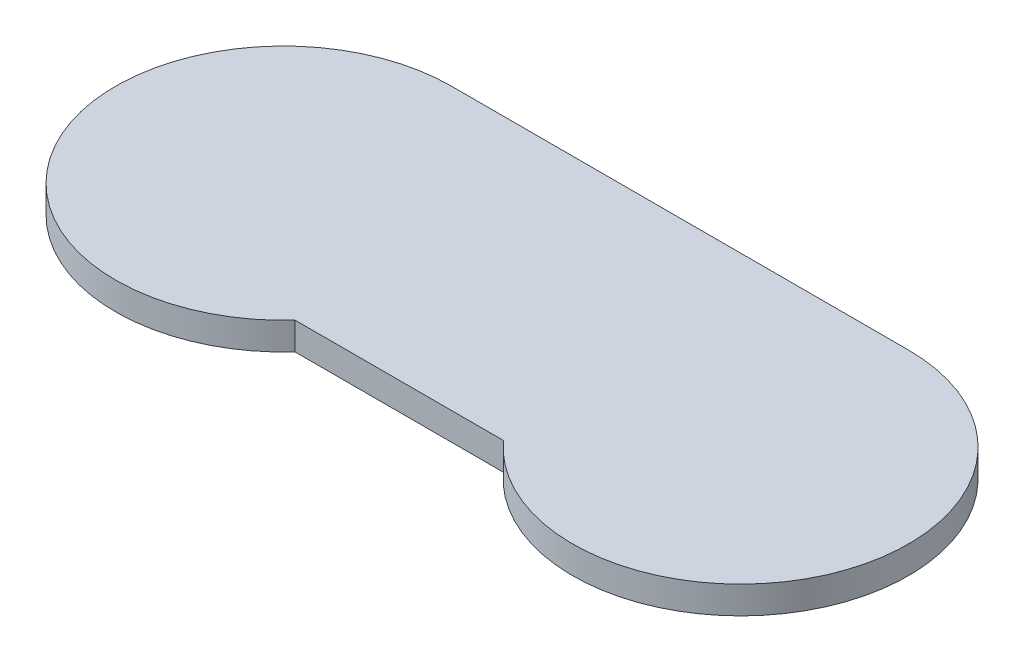
ISO-10303-21;
HEADER;
FILE_DESCRIPTION(('STEP AP214'),'2;1');
FILE_NAME('part.step','',(''),(''),'','','');
FILE_SCHEMA(('AUTOMOTIVE_DESIGN { 1 0 10303 214 1 1 1 1 }'));
ENDSEC;
DATA;
#1=APPLICATION_CONTEXT('core data for automotive mechanical design processes');
#2=APPLICATION_PROTOCOL_DEFINITION('international standard','automotive_design',2000,#1);
#3=PRODUCT_CONTEXT('',#1,'mechanical');
#4=PRODUCT('Part','Part','',(#3));
#5=PRODUCT_RELATED_PRODUCT_CATEGORY('part','',(#4));
#6=PRODUCT_DEFINITION_FORMATION('','',#4);
#7=PRODUCT_DEFINITION_CONTEXT('part definition',#1,'design');
#8=PRODUCT_DEFINITION('design','',#6,#7);
#9=PRODUCT_DEFINITION_SHAPE('','',#8);
#10=(LENGTH_UNIT() NAMED_UNIT(*) SI_UNIT(.MILLI.,.METRE.));
#11=(NAMED_UNIT(*) PLANE_ANGLE_UNIT() SI_UNIT($,.RADIAN.));
#12=(NAMED_UNIT(*) SI_UNIT($,.STERADIAN.) SOLID_ANGLE_UNIT());
#13=UNCERTAINTY_MEASURE_WITH_UNIT(LENGTH_MEASURE(1.E-05),#10,'distance_accuracy_value','');
#14=(GEOMETRIC_REPRESENTATION_CONTEXT(3) GLOBAL_UNCERTAINTY_ASSIGNED_CONTEXT((#13)) GLOBAL_UNIT_ASSIGNED_CONTEXT((#10,
#11,#12)) REPRESENTATION_CONTEXT('',''));
#15=CARTESIAN_POINT('',(0.,0.,0.));
#16=DIRECTION('',(0.,0.,1.));
#17=DIRECTION('',(1.,0.,0.));
#18=AXIS2_PLACEMENT_3D('',#15,#16,#17);
#19=CARTESIAN_POINT('',(-41.5000000000001,5.,0.));
#20=DIRECTION('',(0.,-1.,0.));
#21=DIRECTION('',(0.,0.,-1.));
#22=AXIS2_PLACEMENT_3D('',#19,#20,#21);
#23=CYLINDRICAL_SURFACE('',#22,30.5);
#24=CARTESIAN_POINT('',(-41.5000000000001,0.,0.));
#25=DIRECTION('',(0.,1.,0.));
#26=DIRECTION('',(0.,0.,1.));
#27=AXIS2_PLACEMENT_3D('',#24,#25,#26);
#28=CIRCLE('',#27,30.5);
#29=CARTESIAN_POINT('',(-41.5000000000001,0.,-30.5));
#30=VERTEX_POINT('',#29);
#31=CARTESIAN_POINT('',(-18.9168204187277,0.,20.5));
#32=VERTEX_POINT('',#31);
#33=EDGE_CURVE('E96',#30,#32,#28,.T.);
#34=ORIENTED_EDGE('',*,*,#33,.T.);
#35=DIRECTION('',(0.,-1.,0.));
#36=VECTOR('',#35,1.);
#37=CARTESIAN_POINT('',(-18.9168204187277,5.,20.5));
#38=LINE('',#37,#36);
#39=CARTESIAN_POINT('',(-18.9168204187277,5.,20.5));
#40=VERTEX_POINT('',#39);
#41=EDGE_CURVE('E11',#40,#32,#38,.T.);
#42=ORIENTED_EDGE('',*,*,#41,.F.);
#43=CARTESIAN_POINT('',(-41.5000000000001,5.,0.));
#44=DIRECTION('',(0.,1.,0.));
#45=DIRECTION('',(0.,0.,1.));
#46=AXIS2_PLACEMENT_3D('',#43,#44,#45);
#47=CIRCLE('',#46,30.5);
#48=CARTESIAN_POINT('',(-41.5000000000001,5.,-30.5));
#49=VERTEX_POINT('',#48);
#50=EDGE_CURVE('E84',#49,#40,#47,.T.);
#51=ORIENTED_EDGE('',*,*,#50,.F.);
#52=DIRECTION('',(0.,-1.,0.));
#53=VECTOR('',#52,1.);
#54=CARTESIAN_POINT('',(-41.5000000000001,5.,-30.5));
#55=LINE('',#54,#53);
#56=EDGE_CURVE('E92',#49,#30,#55,.T.);
#57=ORIENTED_EDGE('',*,*,#56,.T.);
#58=EDGE_LOOP('',(#34,#42,#51,#57));
#59=FACE_BOUND('',#58,.T.);
#60=ADVANCED_FACE('F33',(#59),#23,.T.);
#61=CARTESIAN_POINT('',(-18.9168204187277,5.,20.5));
#62=DIRECTION('',(0.,0.,-1.));
#63=DIRECTION('',(-1.,0.,0.));
#64=AXIS2_PLACEMENT_3D('',#61,#62,#63);
#65=PLANE('',#64);
#66=DIRECTION('',(1.,0.,0.));
#67=VECTOR('',#66,1.);
#68=CARTESIAN_POINT('',(-18.9168204187277,0.,20.5));
#69=LINE('',#68,#67);
#70=CARTESIAN_POINT('',(18.9168204187274,0.,20.5));
#71=VERTEX_POINT('',#70);
#72=EDGE_CURVE('E88',#32,#71,#69,.T.);
#73=ORIENTED_EDGE('',*,*,#72,.T.);
#74=DIRECTION('',(0.,-1.,0.));
#75=VECTOR('',#74,1.);
#76=CARTESIAN_POINT('',(18.9168204187274,5.,20.5));
#77=LINE('',#76,#75);
#78=CARTESIAN_POINT('',(18.9168204187274,5.,20.5));
#79=VERTEX_POINT('',#78);
#80=EDGE_CURVE('E41',#79,#71,#77,.T.);
#81=ORIENTED_EDGE('',*,*,#80,.F.);
#82=DIRECTION('',(1.,0.,0.));
#83=VECTOR('',#82,1.);
#84=CARTESIAN_POINT('',(-18.9168204187277,5.,20.5));
#85=LINE('',#84,#83);
#86=EDGE_CURVE('E79',#40,#79,#85,.T.);
#87=ORIENTED_EDGE('',*,*,#86,.F.);
#88=ORIENTED_EDGE('',*,*,#41,.T.);
#89=EDGE_LOOP('',(#73,#81,#87,#88));
#90=FACE_BOUND('',#89,.T.);
#91=ADVANCED_FACE('F87',(#90),#65,.F.);
#92=CARTESIAN_POINT('',(41.4999999999999,5.,0.));
#93=DIRECTION('',(0.,-1.,0.));
#94=DIRECTION('',(0.,0.,-1.));
#95=AXIS2_PLACEMENT_3D('',#92,#93,#94);
#96=CYLINDRICAL_SURFACE('',#95,30.5);
#97=CARTESIAN_POINT('',(41.4999999999999,0.,0.));
#98=DIRECTION('',(0.,1.,0.));
#99=DIRECTION('',(0.,0.,1.));
#100=AXIS2_PLACEMENT_3D('',#97,#98,#99);
#101=CIRCLE('',#100,30.5);
#102=CARTESIAN_POINT('',(41.4999999999999,0.,-30.5));
#103=VERTEX_POINT('',#102);
#104=EDGE_CURVE('E66',#71,#103,#101,.T.);
#105=ORIENTED_EDGE('',*,*,#104,.T.);
#106=DIRECTION('',(0.,-1.,0.));
#107=VECTOR('',#106,1.);
#108=CARTESIAN_POINT('',(41.4999999999999,5.,-30.5));
#109=LINE('',#108,#107);
#110=CARTESIAN_POINT('',(41.4999999999999,5.,-30.5));
#111=VERTEX_POINT('',#110);
#112=EDGE_CURVE('E89',#111,#103,#109,.T.);
#113=ORIENTED_EDGE('',*,*,#112,.F.);
#114=CARTESIAN_POINT('',(41.4999999999999,5.,0.));
#115=DIRECTION('',(0.,1.,0.));
#116=DIRECTION('',(0.,0.,1.));
#117=AXIS2_PLACEMENT_3D('',#114,#115,#116);
#118=CIRCLE('',#117,30.5);
#119=EDGE_CURVE('E82',#79,#111,#118,.T.);
#120=ORIENTED_EDGE('',*,*,#119,.F.);
#121=ORIENTED_EDGE('',*,*,#80,.T.);
#122=EDGE_LOOP('',(#105,#113,#120,#121));
#123=FACE_BOUND('',#122,.T.);
#124=ADVANCED_FACE('F90',(#123),#96,.T.);
#125=CARTESIAN_POINT('',(41.4999999999999,5.,-30.5));
#126=DIRECTION('',(0.,0.,1.));
#127=DIRECTION('',(1.,0.,0.));
#128=AXIS2_PLACEMENT_3D('',#125,#126,#127);
#129=PLANE('',#128);
#130=DIRECTION('',(-1.,0.,0.));
#131=VECTOR('',#130,1.);
#132=CARTESIAN_POINT('',(41.4999999999999,0.,-30.5));
#133=LINE('',#132,#131);
#134=EDGE_CURVE('E72',#103,#30,#133,.T.);
#135=ORIENTED_EDGE('',*,*,#134,.T.);
#136=ORIENTED_EDGE('',*,*,#56,.F.);
#137=DIRECTION('',(-1.,0.,0.));
#138=VECTOR('',#137,1.);
#139=CARTESIAN_POINT('',(41.4999999999999,5.,-30.5));
#140=LINE('',#139,#138);
#141=EDGE_CURVE('E49',#111,#49,#140,.T.);
#142=ORIENTED_EDGE('',*,*,#141,.F.);
#143=ORIENTED_EDGE('',*,*,#112,.T.);
#144=EDGE_LOOP('',(#135,#136,#142,#143));
#145=FACE_BOUND('',#144,.T.);
#146=ADVANCED_FACE('F103',(#145),#129,.F.);
#147=CARTESIAN_POINT('',(-41.5000000000001,5.,0.));
#148=DIRECTION('',(0.,1.,0.));
#149=DIRECTION('',(0.,0.,1.));
#150=AXIS2_PLACEMENT_3D('',#147,#148,#149);
#151=PLANE('',#150);
#152=ORIENTED_EDGE('',*,*,#50,.T.);
#153=ORIENTED_EDGE('',*,*,#86,.T.);
#154=ORIENTED_EDGE('',*,*,#119,.T.);
#155=ORIENTED_EDGE('',*,*,#141,.T.);
#156=EDGE_LOOP('',(#152,#153,#154,#155));
#157=FACE_BOUND('',#156,.T.);
#158=ADVANCED_FACE('F80',(#157),#151,.T.);
#159=CARTESIAN_POINT('',(-41.5000000000001,0.,0.));
#160=DIRECTION('',(0.,1.,0.));
#161=DIRECTION('',(0.,0.,1.));
#162=AXIS2_PLACEMENT_3D('',#159,#160,#161);
#163=PLANE('',#162);
#164=ORIENTED_EDGE('',*,*,#33,.F.);
#165=ORIENTED_EDGE('',*,*,#134,.F.);
#166=ORIENTED_EDGE('',*,*,#104,.F.);
#167=ORIENTED_EDGE('',*,*,#72,.F.);
#168=EDGE_LOOP('',(#164,#165,#166,#167));
#169=FACE_BOUND('',#168,.T.);
#170=ADVANCED_FACE('F106',(#169),#163,.F.);
#171=CLOSED_SHELL('',(#60,#91,#124,#146,#158,#170));
#172=MANIFOLD_SOLID_BREP('B2',#171);
#173=ADVANCED_BREP_SHAPE_REPRESENTATION('',(#18,#172),#14);
#174=SHAPE_DEFINITION_REPRESENTATION(#9,#173);
ENDSEC;
END-ISO-10303-21;
